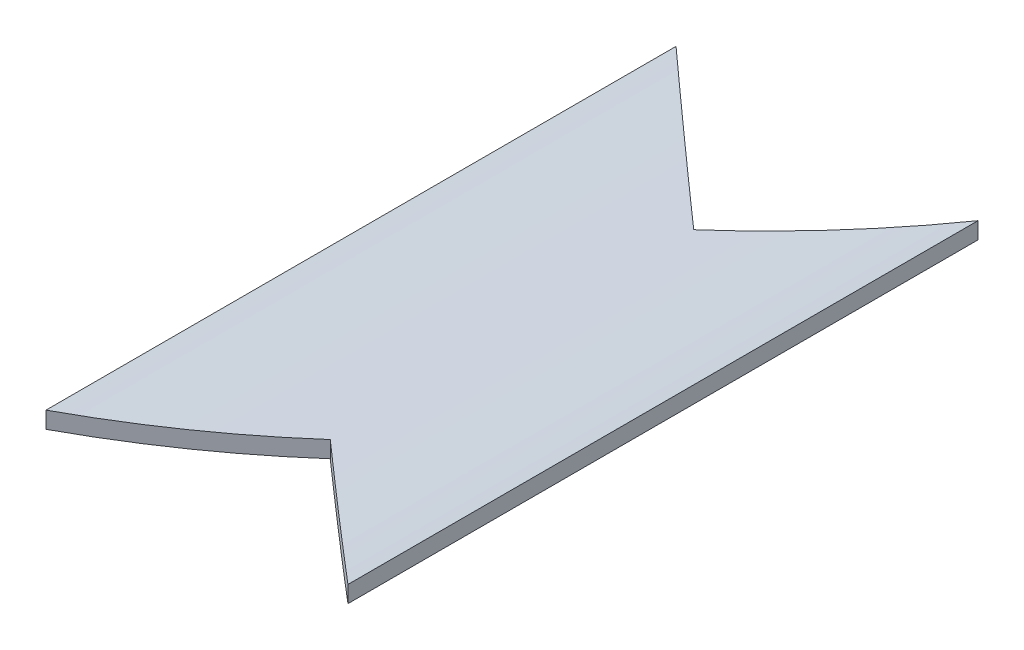
ISO-10303-21;
HEADER;
FILE_DESCRIPTION(('STEP AP214'),'2;1');
FILE_NAME('part.step','',(''),(''),'','','');
FILE_SCHEMA(('AUTOMOTIVE_DESIGN { 1 0 10303 214 1 1 1 1 }'));
ENDSEC;
DATA;
#1=APPLICATION_CONTEXT('core data for automotive mechanical design processes');
#2=APPLICATION_PROTOCOL_DEFINITION('international standard','automotive_design',2000,#1);
#3=PRODUCT_CONTEXT('',#1,'mechanical');
#4=PRODUCT('Part','Part','',(#3));
#5=PRODUCT_RELATED_PRODUCT_CATEGORY('part','',(#4));
#6=PRODUCT_DEFINITION_FORMATION('','',#4);
#7=PRODUCT_DEFINITION_CONTEXT('part definition',#1,'design');
#8=PRODUCT_DEFINITION('design','',#6,#7);
#9=PRODUCT_DEFINITION_SHAPE('','',#8);
#10=(LENGTH_UNIT() NAMED_UNIT(*) SI_UNIT(.MILLI.,.METRE.));
#11=(NAMED_UNIT(*) PLANE_ANGLE_UNIT() SI_UNIT($,.RADIAN.));
#12=(NAMED_UNIT(*) SI_UNIT($,.STERADIAN.) SOLID_ANGLE_UNIT());
#13=UNCERTAINTY_MEASURE_WITH_UNIT(LENGTH_MEASURE(1.E-05),#10,'distance_accuracy_value','');
#14=(GEOMETRIC_REPRESENTATION_CONTEXT(3) GLOBAL_UNCERTAINTY_ASSIGNED_CONTEXT((#13)) GLOBAL_UNIT_ASSIGNED_CONTEXT((#10,
#11,#12)) REPRESENTATION_CONTEXT('',''));
#15=CARTESIAN_POINT('',(0.,0.,0.));
#16=DIRECTION('',(0.,0.,1.));
#17=DIRECTION('',(1.,0.,0.));
#18=AXIS2_PLACEMENT_3D('',#15,#16,#17);
#19=CARTESIAN_POINT('',(-138.04906108728,0.,156.383702012934));
#20=DIRECTION('',(0.661792620529127,0.,-0.749686952943154));
#21=DIRECTION('',(-0.749686952943154,0.,-0.661792620529127));
#22=AXIS2_PLACEMENT_3D('',#19,#20,#21);
#23=PLANE('',#22);
#24=CARTESIAN_POINT('',(115.09375,502.468566815301,379.847700765843));
#25=DIRECTION('',(0.661792620529127,0.,-0.749686952943154));
#26=DIRECTION('',(-0.749686952943154,0.,-0.661792620529127));
#27=AXIS2_PLACEMENT_3D('',#24,#25,#26);
#28=ELLIPSE('',#27,704.118651726816,527.868566523518);
#29=CARTESIAN_POINT('',(115.09375,-25.3999997082174,379.847700765843));
#30=VERTEX_POINT('',#29);
#31=CARTESIAN_POINT('',(230.1875,-12.7,481.447700765842));
#32=VERTEX_POINT('',#31);
#33=EDGE_CURVE('E351',#30,#32,#28,.F.);
#34=ORIENTED_EDGE('',*,*,#33,.T.);
#35=DIRECTION('',(0.,1.,0.));
#36=VECTOR('',#35,1.);
#37=CARTESIAN_POINT('',(230.1875,2.51534904016637E-12,481.447700765842));
#38=LINE('',#37,#36);
#39=CARTESIAN_POINT('',(230.1875,0.,481.447700765842));
#40=VERTEX_POINT('',#39);
#41=EDGE_CURVE('E370',#40,#32,#38,.F.);
#42=ORIENTED_EDGE('',*,*,#41,.F.);
#43=CARTESIAN_POINT('',(115.09375,515.168566815301,379.847700765843));
#44=DIRECTION('',(0.661792620529127,0.,-0.749686952943154));
#45=DIRECTION('',(-0.749686952943154,0.,-0.661792620529127));
#46=AXIS2_PLACEMENT_3D('',#43,#44,#45);
#47=ELLIPSE('',#46,704.118651726816,527.868566523518);
#48=CARTESIAN_POINT('',(115.09375,-12.699999708217,379.847700765843));
#49=VERTEX_POINT('',#48);
#50=EDGE_CURVE('E446',#49,#40,#47,.F.);
#51=ORIENTED_EDGE('',*,*,#50,.F.);
#52=DIRECTION('',(0.,-1.,0.));
#53=VECTOR('',#52,1.);
#54=CARTESIAN_POINT('',(115.09375,0.,379.847700765843));
#55=LINE('',#54,#53);
#56=EDGE_CURVE('E12',#49,#30,#55,.T.);
#57=ORIENTED_EDGE('',*,*,#56,.T.);
#58=EDGE_LOOP('',(#34,#42,#51,#57));
#59=FACE_BOUND('',#58,.T.);
#60=ADVANCED_FACE('F348',(#59),#23,.F.);
#61=CARTESIAN_POINT('',(115.09375,515.168566815301,482.6));
#62=DIRECTION('',(0.,0.,-1.));
#63=DIRECTION('',(-1.,0.,0.));
#64=AXIS2_PLACEMENT_3D('',#61,#62,#63);
#65=CYLINDRICAL_SURFACE('',#64,527.868566523518);
#66=DIRECTION('',(0.,0.,-1.));
#67=VECTOR('',#66,1.);
#68=CARTESIAN_POINT('',(230.1875,0.,482.6));
#69=LINE('',#68,#67);
#70=CARTESIAN_POINT('',(230.1875,0.,1.15229923415761));
#71=VERTEX_POINT('',#70);
#72=EDGE_CURVE('E440',#40,#71,#69,.T.);
#73=ORIENTED_EDGE('',*,*,#72,.T.);
#74=CARTESIAN_POINT('',(115.09375,515.168566815301,102.752299234157));
#75=DIRECTION('',(-0.661792620529127,0.,-0.749686952943154));
#76=DIRECTION('',(0.749686952943154,0.,-0.661792620529127));
#77=AXIS2_PLACEMENT_3D('',#74,#75,#76);
#78=ELLIPSE('',#77,704.118651726816,527.868566523518);
#79=CARTESIAN_POINT('',(115.09375,-12.699999708217,102.752299234157));
#80=VERTEX_POINT('',#79);
#81=EDGE_CURVE('E425',#80,#71,#78,.F.);
#82=ORIENTED_EDGE('',*,*,#81,.F.);
#83=CARTESIAN_POINT('',(115.09375,515.168566815301,102.752299234157));
#84=DIRECTION('',(0.66179262052913,0.,-0.749686952943152));
#85=DIRECTION('',(-0.749686952943152,0.,-0.66179262052913));
#86=AXIS2_PLACEMENT_3D('',#83,#84,#85);
#87=ELLIPSE('',#86,704.118651726818,527.868566523518);
#88=CARTESIAN_POINT('',(0.,0.,1.15229923415694));
#89=VERTEX_POINT('',#88);
#90=EDGE_CURVE('E416',#89,#80,#87,.F.);
#91=ORIENTED_EDGE('',*,*,#90,.F.);
#92=DIRECTION('',(0.,0.,-1.));
#93=VECTOR('',#92,1.);
#94=CARTESIAN_POINT('',(0.,0.,482.6));
#95=LINE('',#94,#93);
#96=CARTESIAN_POINT('',(0.,0.,481.447700765843));
#97=VERTEX_POINT('',#96);
#98=EDGE_CURVE('E401',#97,#89,#95,.T.);
#99=ORIENTED_EDGE('',*,*,#98,.F.);
#100=CARTESIAN_POINT('',(115.09375,515.168566815301,379.847700765843));
#101=DIRECTION('',(-0.66179262052913,0.,-0.749686952943152));
#102=DIRECTION('',(0.749686952943152,0.,-0.66179262052913));
#103=AXIS2_PLACEMENT_3D('',#100,#101,#102);
#104=ELLIPSE('',#103,704.118651726818,527.868566523518);
#105=EDGE_CURVE('E437',#97,#49,#104,.F.);
#106=ORIENTED_EDGE('',*,*,#105,.T.);
#107=ORIENTED_EDGE('',*,*,#50,.T.);
#108=EDGE_LOOP('',(#73,#82,#91,#99,#106,#107));
#109=FACE_BOUND('',#108,.T.);
#110=ADVANCED_FACE('F423',(#109),#65,.F.);
#111=CARTESIAN_POINT('',(115.09375,502.468566815301,482.6));
#112=DIRECTION('',(0.,0.,-1.));
#113=DIRECTION('',(-1.,0.,0.));
#114=AXIS2_PLACEMENT_3D('',#111,#112,#113);
#115=CYLINDRICAL_SURFACE('',#114,527.868566523518);
#116=ORIENTED_EDGE('',*,*,#33,.F.);
#117=CARTESIAN_POINT('',(115.09375,502.468566815301,379.847700765842));
#118=DIRECTION('',(-0.66179262052913,0.,-0.749686952943152));
#119=DIRECTION('',(0.749686952943152,0.,-0.66179262052913));
#120=AXIS2_PLACEMENT_3D('',#117,#118,#119);
#121=ELLIPSE('',#120,704.118651726818,527.868566523518);
#122=CARTESIAN_POINT('',(1.33025439009923E-13,-12.7,481.447700765843));
#123=VERTEX_POINT('',#122);
#124=EDGE_CURVE('E363',#123,#30,#121,.F.);
#125=ORIENTED_EDGE('',*,*,#124,.F.);
#126=DIRECTION('',(0.,0.,-1.));
#127=VECTOR('',#126,1.);
#128=CARTESIAN_POINT('',(1.33025439009923E-13,-12.7,482.6));
#129=LINE('',#128,#127);
#130=CARTESIAN_POINT('',(1.33025439009923E-13,-12.7,1.15229923415694));
#131=VERTEX_POINT('',#130);
#132=EDGE_CURVE('E412',#123,#131,#129,.T.);
#133=ORIENTED_EDGE('',*,*,#132,.T.);
#134=CARTESIAN_POINT('',(115.09375,502.468566815301,102.752299234157));
#135=DIRECTION('',(0.66179262052913,0.,-0.749686952943152));
#136=DIRECTION('',(-0.749686952943152,0.,-0.66179262052913));
#137=AXIS2_PLACEMENT_3D('',#134,#135,#136);
#138=ELLIPSE('',#137,704.118651726818,527.868566523518);
#139=CARTESIAN_POINT('',(115.09375,-25.3999997082173,102.752299234157));
#140=VERTEX_POINT('',#139);
#141=EDGE_CURVE('E419',#131,#140,#138,.F.);
#142=ORIENTED_EDGE('',*,*,#141,.T.);
#143=CARTESIAN_POINT('',(115.09375,502.468566815301,102.752299234157));
#144=DIRECTION('',(-0.661792620529127,0.,-0.749686952943154));
#145=DIRECTION('',(0.749686952943154,0.,-0.661792620529127));
#146=AXIS2_PLACEMENT_3D('',#143,#144,#145);
#147=ELLIPSE('',#146,704.118651726816,527.868566523518);
#148=CARTESIAN_POINT('',(230.1875,-12.7,1.15229923415761));
#149=VERTEX_POINT('',#148);
#150=EDGE_CURVE('E433',#140,#149,#147,.F.);
#151=ORIENTED_EDGE('',*,*,#150,.T.);
#152=DIRECTION('',(0.,0.,-1.));
#153=VECTOR('',#152,1.);
#154=CARTESIAN_POINT('',(230.1875,-12.7,482.6));
#155=LINE('',#154,#153);
#156=EDGE_CURVE('E444',#32,#149,#155,.T.);
#157=ORIENTED_EDGE('',*,*,#156,.F.);
#158=EDGE_LOOP('',(#116,#125,#133,#142,#151,#157));
#159=FACE_BOUND('',#158,.T.);
#160=ADVANCED_FACE('F452',(#159),#115,.T.);
#161=CARTESIAN_POINT('',(230.1875,2.51534904016637E-12,482.6));
#162=DIRECTION('',(1.,0.,0.));
#163=DIRECTION('',(0.,1.,0.));
#164=AXIS2_PLACEMENT_3D('',#161,#162,#163);
#165=PLANE('',#164);
#166=ORIENTED_EDGE('',*,*,#156,.T.);
#167=DIRECTION('',(0.,-1.,0.));
#168=VECTOR('',#167,1.);
#169=CARTESIAN_POINT('',(230.1875,0.,1.15229923415748));
#170=LINE('',#169,#168);
#171=EDGE_CURVE('E420',#149,#71,#170,.F.);
#172=ORIENTED_EDGE('',*,*,#171,.T.);
#173=ORIENTED_EDGE('',*,*,#72,.F.);
#174=ORIENTED_EDGE('',*,*,#41,.T.);
#175=EDGE_LOOP('',(#166,#172,#173,#174));
#176=FACE_BOUND('',#175,.T.);
#177=ADVANCED_FACE('F455',(#176),#165,.T.);
#178=CARTESIAN_POINT('',(238.864159058356,0.,270.588305183293));
#179=DIRECTION('',(-0.66179262052913,0.,-0.749686952943152));
#180=DIRECTION('',(-0.749686952943152,0.,0.66179262052913));
#181=AXIS2_PLACEMENT_3D('',#178,#179,#180);
#182=PLANE('',#181);
#183=ORIENTED_EDGE('',*,*,#56,.F.);
#184=ORIENTED_EDGE('',*,*,#105,.F.);
#185=DIRECTION('',(0.,1.,0.));
#186=VECTOR('',#185,1.);
#187=CARTESIAN_POINT('',(0.,0.,481.447700765843));
#188=LINE('',#187,#186);
#189=EDGE_CURVE('E407',#123,#97,#188,.T.);
#190=ORIENTED_EDGE('',*,*,#189,.F.);
#191=ORIENTED_EDGE('',*,*,#124,.T.);
#192=EDGE_LOOP('',(#183,#184,#190,#191));
#193=FACE_BOUND('',#192,.T.);
#194=ADVANCED_FACE('F465',(#193),#182,.F.);
#195=CARTESIAN_POINT('',(0.,0.,482.6));
#196=DIRECTION('',(1.,0.,0.));
#197=DIRECTION('',(0.,1.,0.));
#198=AXIS2_PLACEMENT_3D('',#195,#196,#197);
#199=PLANE('',#198);
#200=ORIENTED_EDGE('',*,*,#98,.T.);
#201=DIRECTION('',(0.,-1.,0.));
#202=VECTOR('',#201,1.);
#203=CARTESIAN_POINT('',(1.33025439009924E-13,-12.7000000000001,1.15229923415681));
#204=LINE('',#203,#202);
#205=EDGE_CURVE('E405',#89,#131,#204,.T.);
#206=ORIENTED_EDGE('',*,*,#205,.T.);
#207=ORIENTED_EDGE('',*,*,#132,.F.);
#208=ORIENTED_EDGE('',*,*,#189,.T.);
#209=EDGE_LOOP('',(#200,#206,#207,#208));
#210=FACE_BOUND('',#209,.T.);
#211=ADVANCED_FACE('F403',(#210),#199,.F.);
#212=CARTESIAN_POINT('',(101.386796594027,0.,114.852230516671));
#213=DIRECTION('',(-0.661792620529127,0.,-0.749686952943154));
#214=DIRECTION('',(-0.749686952943154,0.,0.661792620529127));
#215=AXIS2_PLACEMENT_3D('',#212,#213,#214);
#216=PLANE('',#215);
#217=ORIENTED_EDGE('',*,*,#150,.F.);
#218=DIRECTION('',(0.,1.,0.));
#219=VECTOR('',#218,1.);
#220=CARTESIAN_POINT('',(115.09375,0.,102.752299234157));
#221=LINE('',#220,#219);
#222=EDGE_CURVE('E426',#140,#80,#221,.T.);
#223=ORIENTED_EDGE('',*,*,#222,.T.);
#224=ORIENTED_EDGE('',*,*,#81,.T.);
#225=ORIENTED_EDGE('',*,*,#171,.F.);
#226=EDGE_LOOP('',(#217,#223,#224,#225));
#227=FACE_BOUND('',#226,.T.);
#228=ADVANCED_FACE('F457',(#227),#216,.T.);
#229=CARTESIAN_POINT('',(-0.571698622950435,0.,0.647627346311037));
#230=DIRECTION('',(0.66179262052913,0.,-0.749686952943152));
#231=DIRECTION('',(-0.749686952943152,0.,-0.66179262052913));
#232=AXIS2_PLACEMENT_3D('',#229,#230,#231);
#233=PLANE('',#232);
#234=ORIENTED_EDGE('',*,*,#141,.F.);
#235=ORIENTED_EDGE('',*,*,#205,.F.);
#236=ORIENTED_EDGE('',*,*,#90,.T.);
#237=ORIENTED_EDGE('',*,*,#222,.F.);
#238=EDGE_LOOP('',(#234,#235,#236,#237));
#239=FACE_BOUND('',#238,.T.);
#240=ADVANCED_FACE('F415',(#239),#233,.T.);
#241=CLOSED_SHELL('',(#60,#110,#160,#177,#194,#211,#228,#240));
#242=MANIFOLD_SOLID_BREP('B2',#241);
#243=ADVANCED_BREP_SHAPE_REPRESENTATION('',(#18,#242),#14);
#244=SHAPE_DEFINITION_REPRESENTATION(#9,#243);
ENDSEC;
END-ISO-10303-21;
